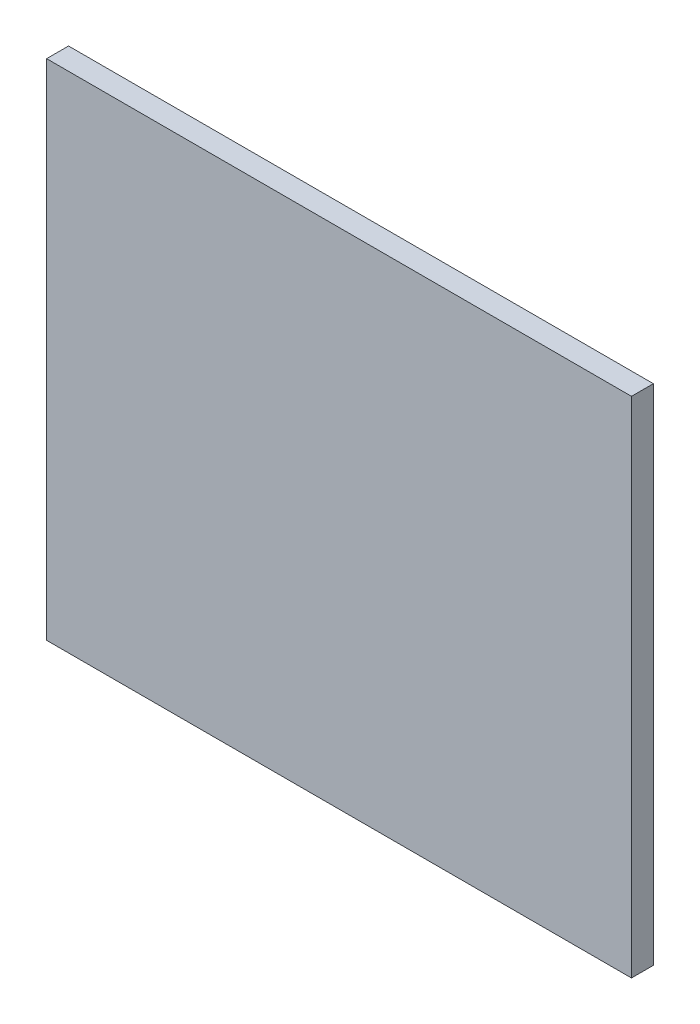
ISO-10303-21;
HEADER;
FILE_DESCRIPTION(('STEP AP214'),'2;1');
FILE_NAME('part.step','',(''),(''),'','','');
FILE_SCHEMA(('AUTOMOTIVE_DESIGN { 1 0 10303 214 1 1 1 1 }'));
ENDSEC;
DATA;
#1=APPLICATION_CONTEXT('core data for automotive mechanical design processes');
#2=APPLICATION_PROTOCOL_DEFINITION('international standard','automotive_design',2000,#1);
#3=PRODUCT_CONTEXT('',#1,'mechanical');
#4=PRODUCT('Part','Part','',(#3));
#5=PRODUCT_RELATED_PRODUCT_CATEGORY('part','',(#4));
#6=PRODUCT_DEFINITION_FORMATION('','',#4);
#7=PRODUCT_DEFINITION_CONTEXT('part definition',#1,'design');
#8=PRODUCT_DEFINITION('design','',#6,#7);
#9=PRODUCT_DEFINITION_SHAPE('','',#8);
#10=(LENGTH_UNIT() NAMED_UNIT(*) SI_UNIT(.MILLI.,.METRE.));
#11=(NAMED_UNIT(*) PLANE_ANGLE_UNIT() SI_UNIT($,.RADIAN.));
#12=(NAMED_UNIT(*) SI_UNIT($,.STERADIAN.) SOLID_ANGLE_UNIT());
#13=UNCERTAINTY_MEASURE_WITH_UNIT(LENGTH_MEASURE(1.E-05),#10,'distance_accuracy_value','');
#14=(GEOMETRIC_REPRESENTATION_CONTEXT(3) GLOBAL_UNCERTAINTY_ASSIGNED_CONTEXT((#13)) GLOBAL_UNIT_ASSIGNED_CONTEXT((#10,
#11,#12)) REPRESENTATION_CONTEXT('',''));
#15=CARTESIAN_POINT('',(0.,0.,0.));
#16=DIRECTION('',(0.,0.,1.));
#17=DIRECTION('',(1.,0.,0.));
#18=AXIS2_PLACEMENT_3D('',#15,#16,#17);
#19=CARTESIAN_POINT('',(-169.5,146.,12.7));
#20=DIRECTION('',(1.,0.,0.));
#21=DIRECTION('',(0.,1.,0.));
#22=AXIS2_PLACEMENT_3D('',#19,#20,#21);
#23=PLANE('',#22);
#24=DIRECTION('',(0.,-1.,0.));
#25=VECTOR('',#24,1.);
#26=CARTESIAN_POINT('',(-169.5,146.,0.));
#27=LINE('',#26,#25);
#28=CARTESIAN_POINT('',(-169.5,146.,0.));
#29=VERTEX_POINT('',#28);
#30=CARTESIAN_POINT('',(-169.5,-146.,0.));
#31=VERTEX_POINT('',#30);
#32=EDGE_CURVE('E94',#29,#31,#27,.T.);
#33=ORIENTED_EDGE('',*,*,#32,.T.);
#34=DIRECTION('',(0.,0.,-1.));
#35=VECTOR('',#34,1.);
#36=CARTESIAN_POINT('',(-169.5,-146.,12.7));
#37=LINE('',#36,#35);
#38=CARTESIAN_POINT('',(-169.5,-146.,12.7));
#39=VERTEX_POINT('',#38);
#40=EDGE_CURVE('E11',#39,#31,#37,.T.);
#41=ORIENTED_EDGE('',*,*,#40,.F.);
#42=DIRECTION('',(0.,-1.,0.));
#43=VECTOR('',#42,1.);
#44=CARTESIAN_POINT('',(-169.5,146.,12.7));
#45=LINE('',#44,#43);
#46=CARTESIAN_POINT('',(-169.5,146.,12.7));
#47=VERTEX_POINT('',#46);
#48=EDGE_CURVE('E82',#47,#39,#45,.T.);
#49=ORIENTED_EDGE('',*,*,#48,.F.);
#50=DIRECTION('',(0.,0.,-1.));
#51=VECTOR('',#50,1.);
#52=CARTESIAN_POINT('',(-169.5,146.,12.7));
#53=LINE('',#52,#51);
#54=EDGE_CURVE('E90',#47,#29,#53,.T.);
#55=ORIENTED_EDGE('',*,*,#54,.T.);
#56=EDGE_LOOP('',(#33,#41,#49,#55));
#57=FACE_BOUND('',#56,.T.);
#58=ADVANCED_FACE('F31',(#57),#23,.F.);
#59=CARTESIAN_POINT('',(-169.5,-146.,12.7));
#60=DIRECTION('',(0.,1.,0.));
#61=DIRECTION('',(0.,0.,1.));
#62=AXIS2_PLACEMENT_3D('',#59,#60,#61);
#63=PLANE('',#62);
#64=DIRECTION('',(1.,0.,0.));
#65=VECTOR('',#64,1.);
#66=CARTESIAN_POINT('',(-169.5,-146.,0.));
#67=LINE('',#66,#65);
#68=CARTESIAN_POINT('',(169.5,-146.,0.));
#69=VERTEX_POINT('',#68);
#70=EDGE_CURVE('E86',#31,#69,#67,.T.);
#71=ORIENTED_EDGE('',*,*,#70,.T.);
#72=DIRECTION('',(0.,0.,-1.));
#73=VECTOR('',#72,1.);
#74=CARTESIAN_POINT('',(169.5,-146.,12.7));
#75=LINE('',#74,#73);
#76=CARTESIAN_POINT('',(169.5,-146.,12.7));
#77=VERTEX_POINT('',#76);
#78=EDGE_CURVE('E39',#77,#69,#75,.T.);
#79=ORIENTED_EDGE('',*,*,#78,.F.);
#80=DIRECTION('',(1.,0.,0.));
#81=VECTOR('',#80,1.);
#82=CARTESIAN_POINT('',(-169.5,-146.,12.7));
#83=LINE('',#82,#81);
#84=EDGE_CURVE('E77',#39,#77,#83,.T.);
#85=ORIENTED_EDGE('',*,*,#84,.F.);
#86=ORIENTED_EDGE('',*,*,#40,.T.);
#87=EDGE_LOOP('',(#71,#79,#85,#86));
#88=FACE_BOUND('',#87,.T.);
#89=ADVANCED_FACE('F85',(#88),#63,.F.);
#90=CARTESIAN_POINT('',(169.5,146.,12.7));
#91=DIRECTION('',(-1.,0.,0.));
#92=DIRECTION('',(0.,-1.,0.));
#93=AXIS2_PLACEMENT_3D('',#90,#91,#92);
#94=PLANE('',#93);
#95=DIRECTION('',(0.,1.,0.));
#96=VECTOR('',#95,1.);
#97=CARTESIAN_POINT('',(169.5,146.,0.));
#98=LINE('',#97,#96);
#99=CARTESIAN_POINT('',(169.5,146.,0.));
#100=VERTEX_POINT('',#99);
#101=EDGE_CURVE('E64',#69,#100,#98,.T.);
#102=ORIENTED_EDGE('',*,*,#101,.T.);
#103=DIRECTION('',(0.,0.,-1.));
#104=VECTOR('',#103,1.);
#105=CARTESIAN_POINT('',(169.5,146.,12.7));
#106=LINE('',#105,#104);
#107=CARTESIAN_POINT('',(169.5,146.,12.7));
#108=VERTEX_POINT('',#107);
#109=EDGE_CURVE('E87',#108,#100,#106,.T.);
#110=ORIENTED_EDGE('',*,*,#109,.F.);
#111=DIRECTION('',(0.,1.,0.));
#112=VECTOR('',#111,1.);
#113=CARTESIAN_POINT('',(169.5,146.,12.7));
#114=LINE('',#113,#112);
#115=EDGE_CURVE('E80',#77,#108,#114,.T.);
#116=ORIENTED_EDGE('',*,*,#115,.F.);
#117=ORIENTED_EDGE('',*,*,#78,.T.);
#118=EDGE_LOOP('',(#102,#110,#116,#117));
#119=FACE_BOUND('',#118,.T.);
#120=ADVANCED_FACE('F88',(#119),#94,.F.);
#121=CARTESIAN_POINT('',(-169.5,146.,12.7));
#122=DIRECTION('',(0.,-1.,0.));
#123=DIRECTION('',(0.,0.,-1.));
#124=AXIS2_PLACEMENT_3D('',#121,#122,#123);
#125=PLANE('',#124);
#126=DIRECTION('',(-1.,0.,0.));
#127=VECTOR('',#126,1.);
#128=CARTESIAN_POINT('',(-169.5,146.,0.));
#129=LINE('',#128,#127);
#130=EDGE_CURVE('E70',#100,#29,#129,.T.);
#131=ORIENTED_EDGE('',*,*,#130,.T.);
#132=ORIENTED_EDGE('',*,*,#54,.F.);
#133=DIRECTION('',(-1.,0.,0.));
#134=VECTOR('',#133,1.);
#135=CARTESIAN_POINT('',(-169.5,146.,12.7));
#136=LINE('',#135,#134);
#137=EDGE_CURVE('E47',#108,#47,#136,.T.);
#138=ORIENTED_EDGE('',*,*,#137,.F.);
#139=ORIENTED_EDGE('',*,*,#109,.T.);
#140=EDGE_LOOP('',(#131,#132,#138,#139));
#141=FACE_BOUND('',#140,.T.);
#142=ADVANCED_FACE('F101',(#141),#125,.F.);
#143=CARTESIAN_POINT('',(-169.5,-146.,12.7));
#144=DIRECTION('',(0.,0.,1.));
#145=DIRECTION('',(1.,0.,0.));
#146=AXIS2_PLACEMENT_3D('',#143,#144,#145);
#147=PLANE('',#146);
#148=ORIENTED_EDGE('',*,*,#48,.T.);
#149=ORIENTED_EDGE('',*,*,#84,.T.);
#150=ORIENTED_EDGE('',*,*,#115,.T.);
#151=ORIENTED_EDGE('',*,*,#137,.T.);
#152=EDGE_LOOP('',(#148,#149,#150,#151));
#153=FACE_BOUND('',#152,.T.);
#154=ADVANCED_FACE('F78',(#153),#147,.T.);
#155=CARTESIAN_POINT('',(-169.5,-146.,0.));
#156=DIRECTION('',(0.,0.,1.));
#157=DIRECTION('',(1.,0.,0.));
#158=AXIS2_PLACEMENT_3D('',#155,#156,#157);
#159=PLANE('',#158);
#160=ORIENTED_EDGE('',*,*,#32,.F.);
#161=ORIENTED_EDGE('',*,*,#130,.F.);
#162=ORIENTED_EDGE('',*,*,#101,.F.);
#163=ORIENTED_EDGE('',*,*,#70,.F.);
#164=EDGE_LOOP('',(#160,#161,#162,#163));
#165=FACE_BOUND('',#164,.T.);
#166=ADVANCED_FACE('F104',(#165),#159,.F.);
#167=CLOSED_SHELL('',(#58,#89,#120,#142,#154,#166));
#168=MANIFOLD_SOLID_BREP('B2',#167);
#169=ADVANCED_BREP_SHAPE_REPRESENTATION('',(#18,#168),#14);
#170=SHAPE_DEFINITION_REPRESENTATION(#9,#169);
ENDSEC;
END-ISO-10303-21;
